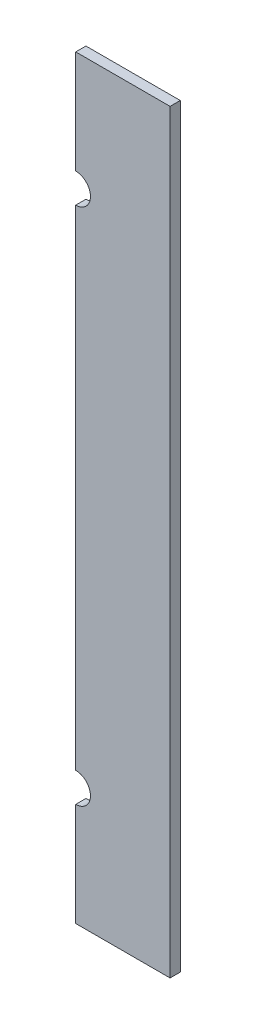
ISO-10303-21;
HEADER;
FILE_DESCRIPTION(('STEP AP214'),'2;1');
FILE_NAME('part.step','',(''),(''),'','','');
FILE_SCHEMA(('AUTOMOTIVE_DESIGN { 1 0 10303 214 1 1 1 1 }'));
ENDSEC;
DATA;
#1=APPLICATION_CONTEXT('core data for automotive mechanical design processes');
#2=APPLICATION_PROTOCOL_DEFINITION('international standard','automotive_design',2000,#1);
#3=PRODUCT_CONTEXT('',#1,'mechanical');
#4=PRODUCT('Part','Part','',(#3));
#5=PRODUCT_RELATED_PRODUCT_CATEGORY('part','',(#4));
#6=PRODUCT_DEFINITION_FORMATION('','',#4);
#7=PRODUCT_DEFINITION_CONTEXT('part definition',#1,'design');
#8=PRODUCT_DEFINITION('design','',#6,#7);
#9=PRODUCT_DEFINITION_SHAPE('','',#8);
#10=(LENGTH_UNIT() NAMED_UNIT(*) SI_UNIT(.MILLI.,.METRE.));
#11=(NAMED_UNIT(*) PLANE_ANGLE_UNIT() SI_UNIT($,.RADIAN.));
#12=(NAMED_UNIT(*) SI_UNIT($,.STERADIAN.) SOLID_ANGLE_UNIT());
#13=UNCERTAINTY_MEASURE_WITH_UNIT(LENGTH_MEASURE(1.E-05),#10,'distance_accuracy_value','');
#14=(GEOMETRIC_REPRESENTATION_CONTEXT(3) GLOBAL_UNCERTAINTY_ASSIGNED_CONTEXT((#13)) GLOBAL_UNIT_ASSIGNED_CONTEXT((#10,
#11,#12)) REPRESENTATION_CONTEXT('',''));
#15=CARTESIAN_POINT('',(0.,0.,0.));
#16=DIRECTION('',(0.,0.,1.));
#17=DIRECTION('',(1.,0.,0.));
#18=AXIS2_PLACEMENT_3D('',#15,#16,#17);
#19=CARTESIAN_POINT('',(0.,203.2,0.));
#20=DIRECTION('',(1.,0.,0.));
#21=DIRECTION('',(0.,0.,-1.));
#22=AXIS2_PLACEMENT_3D('',#19,#20,#21);
#23=PLANE('',#22);
#24=DIRECTION('',(0.,-1.,0.));
#25=VECTOR('',#24,1.);
#26=CARTESIAN_POINT('',(0.,203.2,0.));
#27=LINE('',#26,#25);
#28=CARTESIAN_POINT('',(0.,167.481249999994,0.));
#29=VERTEX_POINT('',#28);
#30=CARTESIAN_POINT('',(0.,35.7187499999722,0.));
#31=VERTEX_POINT('',#30);
#32=EDGE_CURVE('E118',#29,#31,#27,.T.);
#33=ORIENTED_EDGE('',*,*,#32,.T.);
#34=DIRECTION('',(0.,0.,1.));
#35=VECTOR('',#34,1.);
#36=CARTESIAN_POINT('',(0.,35.7187499999722,0.));
#37=LINE('',#36,#35);
#38=CARTESIAN_POINT('',(0.,35.7187499999722,2.7432));
#39=VERTEX_POINT('',#38);
#40=EDGE_CURVE('E61',#31,#39,#37,.T.);
#41=ORIENTED_EDGE('',*,*,#40,.T.);
#42=DIRECTION('',(0.,-1.,0.));
#43=VECTOR('',#42,1.);
#44=CARTESIAN_POINT('',(0.,203.2,2.7432));
#45=LINE('',#44,#43);
#46=CARTESIAN_POINT('',(0.,167.481249999994,2.7432));
#47=VERTEX_POINT('',#46);
#48=EDGE_CURVE('E120',#47,#39,#45,.T.);
#49=ORIENTED_EDGE('',*,*,#48,.F.);
#50=DIRECTION('',(0.,0.,1.));
#51=VECTOR('',#50,1.);
#52=CARTESIAN_POINT('',(0.,167.481249999994,0.));
#53=LINE('',#52,#51);
#54=EDGE_CURVE('E109',#47,#29,#53,.F.);
#55=ORIENTED_EDGE('',*,*,#54,.T.);
#56=EDGE_LOOP('',(#33,#41,#49,#55));
#57=FACE_BOUND('',#56,.T.);
#58=ADVANCED_FACE('F46',(#57),#23,.F.);
#59=CARTESIAN_POINT('',(0.,203.2,0.));
#60=VERTEX_POINT('',#59);
#61=CARTESIAN_POINT('',(0.,175.418749999994,0.));
#62=VERTEX_POINT('',#61);
#63=EDGE_CURVE('E126',#60,#62,#27,.T.);
#64=ORIENTED_EDGE('',*,*,#63,.T.);
#65=DIRECTION('',(0.,0.,1.));
#66=VECTOR('',#65,1.);
#67=CARTESIAN_POINT('',(0.,175.418749999994,0.));
#68=LINE('',#67,#66);
#69=CARTESIAN_POINT('',(0.,175.418749999994,2.7432));
#70=VERTEX_POINT('',#69);
#71=EDGE_CURVE('E69',#62,#70,#68,.T.);
#72=ORIENTED_EDGE('',*,*,#71,.T.);
#73=CARTESIAN_POINT('',(0.,203.2,2.7432));
#74=VERTEX_POINT('',#73);
#75=EDGE_CURVE('E54',#74,#70,#45,.T.);
#76=ORIENTED_EDGE('',*,*,#75,.F.);
#77=DIRECTION('',(0.,0.,1.));
#78=VECTOR('',#77,1.);
#79=CARTESIAN_POINT('',(0.,203.2,0.));
#80=LINE('',#79,#78);
#81=EDGE_CURVE('E169',#60,#74,#80,.T.);
#82=ORIENTED_EDGE('',*,*,#81,.F.);
#83=EDGE_LOOP('',(#64,#72,#76,#82));
#84=FACE_BOUND('',#83,.T.);
#85=ADVANCED_FACE('F182',(#84),#23,.F.);
#86=CARTESIAN_POINT('',(0.,27.7812499999722,2.7432));
#87=VERTEX_POINT('',#86);
#88=CARTESIAN_POINT('',(0.,0.,2.7432));
#89=VERTEX_POINT('',#88);
#90=EDGE_CURVE('E139',#87,#89,#45,.T.);
#91=ORIENTED_EDGE('',*,*,#90,.F.);
#92=DIRECTION('',(0.,0.,1.));
#93=VECTOR('',#92,1.);
#94=CARTESIAN_POINT('',(0.,27.7812499999722,0.));
#95=LINE('',#94,#93);
#96=CARTESIAN_POINT('',(0.,27.7812499999722,0.));
#97=VERTEX_POINT('',#96);
#98=EDGE_CURVE('E163',#87,#97,#95,.F.);
#99=ORIENTED_EDGE('',*,*,#98,.T.);
#100=CARTESIAN_POINT('',(0.,0.,0.));
#101=VERTEX_POINT('',#100);
#102=EDGE_CURVE('E127',#97,#101,#27,.T.);
#103=ORIENTED_EDGE('',*,*,#102,.T.);
#104=DIRECTION('',(0.,0.,1.));
#105=VECTOR('',#104,1.);
#106=CARTESIAN_POINT('',(0.,0.,0.));
#107=LINE('',#106,#105);
#108=EDGE_CURVE('E158',#101,#89,#107,.T.);
#109=ORIENTED_EDGE('',*,*,#108,.T.);
#110=EDGE_LOOP('',(#91,#99,#103,#109));
#111=FACE_BOUND('',#110,.T.);
#112=ADVANCED_FACE('F48',(#111),#23,.F.);
#113=CARTESIAN_POINT('',(0.,203.2,2.7432));
#114=DIRECTION('',(0.,0.,-1.));
#115=DIRECTION('',(-1.,0.,0.));
#116=AXIS2_PLACEMENT_3D('',#113,#114,#115);
#117=PLANE('',#116);
#118=ORIENTED_EDGE('',*,*,#48,.T.);
#119=CARTESIAN_POINT('',(3.10862446895044E-12,31.7499999999722,2.7432));
#120=DIRECTION('',(0.,0.,-1.));
#121=DIRECTION('',(-1.,0.,0.));
#122=AXIS2_PLACEMENT_3D('',#119,#120,#121);
#123=CIRCLE('',#122,3.96875);
#124=EDGE_CURVE('E149',#39,#87,#123,.T.);
#125=ORIENTED_EDGE('',*,*,#124,.T.);
#126=ORIENTED_EDGE('',*,*,#90,.T.);
#127=DIRECTION('',(1.,0.,0.));
#128=VECTOR('',#127,1.);
#129=CARTESIAN_POINT('',(0.,0.,2.7432));
#130=LINE('',#129,#128);
#131=CARTESIAN_POINT('',(25.4,0.,2.7432));
#132=VERTEX_POINT('',#131);
#133=EDGE_CURVE('E148',#89,#132,#130,.T.);
#134=ORIENTED_EDGE('',*,*,#133,.T.);
#135=DIRECTION('',(0.,-1.,0.));
#136=VECTOR('',#135,1.);
#137=CARTESIAN_POINT('',(25.4,203.2,2.7432));
#138=LINE('',#137,#136);
#139=CARTESIAN_POINT('',(25.4,203.2,2.7432));
#140=VERTEX_POINT('',#139);
#141=EDGE_CURVE('E137',#140,#132,#138,.T.);
#142=ORIENTED_EDGE('',*,*,#141,.F.);
#143=DIRECTION('',(1.,0.,0.));
#144=VECTOR('',#143,1.);
#145=CARTESIAN_POINT('',(0.,203.2,2.7432));
#146=LINE('',#145,#144);
#147=EDGE_CURVE('E171',#74,#140,#146,.T.);
#148=ORIENTED_EDGE('',*,*,#147,.F.);
#149=ORIENTED_EDGE('',*,*,#75,.T.);
#150=CARTESIAN_POINT('',(3.10862446895044E-12,171.449999999994,2.7432));
#151=DIRECTION('',(0.,0.,-1.));
#152=DIRECTION('',(-1.,0.,0.));
#153=AXIS2_PLACEMENT_3D('',#150,#151,#152);
#154=CIRCLE('',#153,3.96875);
#155=EDGE_CURVE('E121',#70,#47,#154,.T.);
#156=ORIENTED_EDGE('',*,*,#155,.T.);
#157=EDGE_LOOP('',(#118,#125,#126,#134,#142,#148,#149,#156));
#158=FACE_BOUND('',#157,.T.);
#159=ADVANCED_FACE('F146',(#158),#117,.F.);
#160=CARTESIAN_POINT('',(25.4,203.2,0.));
#161=DIRECTION('',(-1.,0.,0.));
#162=DIRECTION('',(0.,0.,1.));
#163=AXIS2_PLACEMENT_3D('',#160,#161,#162);
#164=PLANE('',#163);
#165=DIRECTION('',(0.,0.,-1.));
#166=VECTOR('',#165,1.);
#167=CARTESIAN_POINT('',(25.4,0.,0.));
#168=LINE('',#167,#166);
#169=CARTESIAN_POINT('',(25.4,0.,0.));
#170=VERTEX_POINT('',#169);
#171=EDGE_CURVE('E159',#132,#170,#168,.T.);
#172=ORIENTED_EDGE('',*,*,#171,.T.);
#173=DIRECTION('',(0.,-1.,0.));
#174=VECTOR('',#173,1.);
#175=CARTESIAN_POINT('',(25.4,203.2,0.));
#176=LINE('',#175,#174);
#177=CARTESIAN_POINT('',(25.4,203.2,0.));
#178=VERTEX_POINT('',#177);
#179=EDGE_CURVE('E129',#178,#170,#176,.T.);
#180=ORIENTED_EDGE('',*,*,#179,.F.);
#181=DIRECTION('',(0.,0.,-1.));
#182=VECTOR('',#181,1.);
#183=CARTESIAN_POINT('',(25.4,203.2,0.));
#184=LINE('',#183,#182);
#185=EDGE_CURVE('E175',#140,#178,#184,.T.);
#186=ORIENTED_EDGE('',*,*,#185,.F.);
#187=ORIENTED_EDGE('',*,*,#141,.T.);
#188=EDGE_LOOP('',(#172,#180,#186,#187));
#189=FACE_BOUND('',#188,.T.);
#190=ADVANCED_FACE('F203',(#189),#164,.F.);
#191=CARTESIAN_POINT('',(0.,203.2,0.));
#192=DIRECTION('',(0.,0.,1.));
#193=DIRECTION('',(1.,0.,0.));
#194=AXIS2_PLACEMENT_3D('',#191,#192,#193);
#195=PLANE('',#194);
#196=ORIENTED_EDGE('',*,*,#102,.F.);
#197=CARTESIAN_POINT('',(3.10862446895044E-12,31.7499999999722,0.));
#198=DIRECTION('',(0.,0.,1.));
#199=DIRECTION('',(-1.,0.,0.));
#200=AXIS2_PLACEMENT_3D('',#197,#198,#199);
#201=CIRCLE('',#200,3.96875);
#202=EDGE_CURVE('E125',#97,#31,#201,.T.);
#203=ORIENTED_EDGE('',*,*,#202,.T.);
#204=ORIENTED_EDGE('',*,*,#32,.F.);
#205=CARTESIAN_POINT('',(3.10862446895044E-12,171.449999999994,0.));
#206=DIRECTION('',(0.,0.,1.));
#207=DIRECTION('',(1.,0.,0.));
#208=AXIS2_PLACEMENT_3D('',#205,#206,#207);
#209=CIRCLE('',#208,3.96875);
#210=EDGE_CURVE('E11',#29,#62,#209,.T.);
#211=ORIENTED_EDGE('',*,*,#210,.T.);
#212=ORIENTED_EDGE('',*,*,#63,.F.);
#213=DIRECTION('',(-1.,0.,0.));
#214=VECTOR('',#213,1.);
#215=CARTESIAN_POINT('',(0.,203.2,0.));
#216=LINE('',#215,#214);
#217=EDGE_CURVE('E130',#178,#60,#216,.T.);
#218=ORIENTED_EDGE('',*,*,#217,.F.);
#219=ORIENTED_EDGE('',*,*,#179,.T.);
#220=DIRECTION('',(-1.,0.,0.));
#221=VECTOR('',#220,1.);
#222=CARTESIAN_POINT('',(0.,0.,0.));
#223=LINE('',#222,#221);
#224=EDGE_CURVE('E133',#170,#101,#223,.T.);
#225=ORIENTED_EDGE('',*,*,#224,.T.);
#226=EDGE_LOOP('',(#196,#203,#204,#211,#212,#218,#219,#225));
#227=FACE_BOUND('',#226,.T.);
#228=ADVANCED_FACE('F124',(#227),#195,.F.);
#229=CARTESIAN_POINT('',(0.,203.2,0.));
#230=DIRECTION('',(0.,1.,0.));
#231=DIRECTION('',(0.,0.,1.));
#232=AXIS2_PLACEMENT_3D('',#229,#230,#231);
#233=PLANE('',#232);
#234=ORIENTED_EDGE('',*,*,#81,.T.);
#235=ORIENTED_EDGE('',*,*,#147,.T.);
#236=ORIENTED_EDGE('',*,*,#185,.T.);
#237=ORIENTED_EDGE('',*,*,#217,.T.);
#238=EDGE_LOOP('',(#234,#235,#236,#237));
#239=FACE_BOUND('',#238,.T.);
#240=ADVANCED_FACE('F180',(#239),#233,.T.);
#241=CARTESIAN_POINT('',(0.,0.,0.));
#242=DIRECTION('',(0.,1.,0.));
#243=DIRECTION('',(0.,0.,1.));
#244=AXIS2_PLACEMENT_3D('',#241,#242,#243);
#245=PLANE('',#244);
#246=ORIENTED_EDGE('',*,*,#108,.F.);
#247=ORIENTED_EDGE('',*,*,#224,.F.);
#248=ORIENTED_EDGE('',*,*,#171,.F.);
#249=ORIENTED_EDGE('',*,*,#133,.F.);
#250=EDGE_LOOP('',(#246,#247,#248,#249));
#251=FACE_BOUND('',#250,.T.);
#252=ADVANCED_FACE('F156',(#251),#245,.F.);
#253=CARTESIAN_POINT('',(3.10862446895044E-12,171.449999999994,0.));
#254=DIRECTION('',(0.,0.,1.));
#255=DIRECTION('',(1.,0.,0.));
#256=AXIS2_PLACEMENT_3D('',#253,#254,#255);
#257=CYLINDRICAL_SURFACE('',#256,3.96875);
#258=ORIENTED_EDGE('',*,*,#210,.F.);
#259=ORIENTED_EDGE('',*,*,#54,.F.);
#260=ORIENTED_EDGE('',*,*,#155,.F.);
#261=ORIENTED_EDGE('',*,*,#71,.F.);
#262=EDGE_LOOP('',(#258,#259,#260,#261));
#263=FACE_BOUND('',#262,.T.);
#264=ADVANCED_FACE('F108',(#263),#257,.F.);
#265=CARTESIAN_POINT('',(3.10862446895044E-12,31.7499999999722,0.));
#266=DIRECTION('',(0.,0.,1.));
#267=DIRECTION('',(1.,0.,0.));
#268=AXIS2_PLACEMENT_3D('',#265,#266,#267);
#269=CYLINDRICAL_SURFACE('',#268,3.96875);
#270=ORIENTED_EDGE('',*,*,#202,.F.);
#271=ORIENTED_EDGE('',*,*,#98,.F.);
#272=ORIENTED_EDGE('',*,*,#124,.F.);
#273=ORIENTED_EDGE('',*,*,#40,.F.);
#274=EDGE_LOOP('',(#270,#271,#272,#273));
#275=FACE_BOUND('',#274,.T.);
#276=ADVANCED_FACE('F186',(#275),#269,.F.);
#277=CLOSED_SHELL('',(#58,#85,#112,#159,#190,#228,#240,#252,#264,#276));
#278=MANIFOLD_SOLID_BREP('B2',#277);
#279=ADVANCED_BREP_SHAPE_REPRESENTATION('',(#18,#278),#14);
#280=SHAPE_DEFINITION_REPRESENTATION(#9,#279);
ENDSEC;
END-ISO-10303-21;
